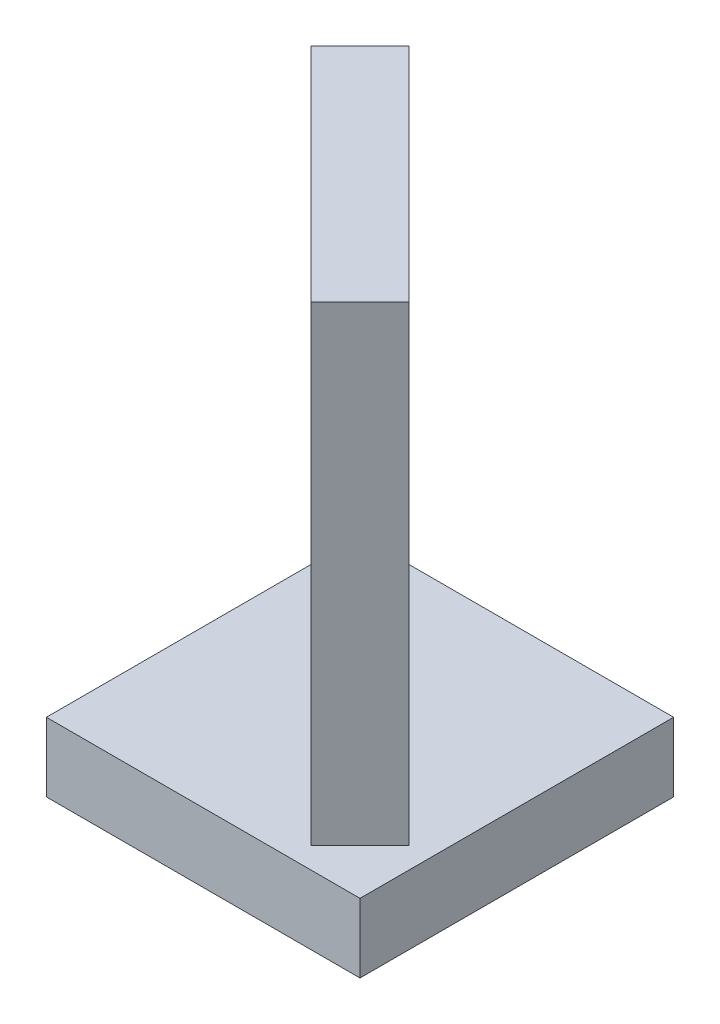
ISO-10303-21;
HEADER;
FILE_DESCRIPTION(('STEP AP214'),'2;1');
FILE_NAME('part.step','',(''),(''),'','','');
FILE_SCHEMA(('AUTOMOTIVE_DESIGN { 1 0 10303 214 1 1 1 1 }'));
ENDSEC;
DATA;
#1=APPLICATION_CONTEXT('core data for automotive mechanical design processes');
#2=APPLICATION_PROTOCOL_DEFINITION('international standard','automotive_design',2000,#1);
#3=PRODUCT_CONTEXT('',#1,'mechanical');
#4=PRODUCT('Part','Part','',(#3));
#5=PRODUCT_RELATED_PRODUCT_CATEGORY('part','',(#4));
#6=PRODUCT_DEFINITION_FORMATION('','',#4);
#7=PRODUCT_DEFINITION_CONTEXT('part definition',#1,'design');
#8=PRODUCT_DEFINITION('design','',#6,#7);
#9=PRODUCT_DEFINITION_SHAPE('','',#8);
#10=(LENGTH_UNIT() NAMED_UNIT(*) SI_UNIT(.MILLI.,.METRE.));
#11=(NAMED_UNIT(*) PLANE_ANGLE_UNIT() SI_UNIT($,.RADIAN.));
#12=(NAMED_UNIT(*) SI_UNIT($,.STERADIAN.) SOLID_ANGLE_UNIT());
#13=UNCERTAINTY_MEASURE_WITH_UNIT(LENGTH_MEASURE(1.E-05),#10,'distance_accuracy_value','');
#14=(GEOMETRIC_REPRESENTATION_CONTEXT(3) GLOBAL_UNCERTAINTY_ASSIGNED_CONTEXT((#13)) GLOBAL_UNIT_ASSIGNED_CONTEXT((#10,
#11,#12)) REPRESENTATION_CONTEXT('',''));
#15=CARTESIAN_POINT('',(0.,0.,0.));
#16=DIRECTION('',(0.,0.,1.));
#17=DIRECTION('',(1.,0.,0.));
#18=AXIS2_PLACEMENT_3D('',#15,#16,#17);
#19=CARTESIAN_POINT('',(0.,5.588,0.));
#20=DIRECTION('',(0.,-1.,0.));
#21=DIRECTION('',(0.,0.,-1.));
#22=AXIS2_PLACEMENT_3D('',#19,#20,#21);
#23=PLANE('',#22);
#24=DIRECTION('',(0.,0.,-1.));
#25=VECTOR('',#24,1.);
#26=CARTESIAN_POINT('',(12.7,5.588,12.7));
#27=LINE('',#26,#25);
#28=CARTESIAN_POINT('',(12.7,5.588,12.7));
#29=VERTEX_POINT('',#28);
#30=CARTESIAN_POINT('',(12.7,5.588,-12.7));
#31=VERTEX_POINT('',#30);
#32=EDGE_CURVE('E128',#29,#31,#27,.T.);
#33=ORIENTED_EDGE('',*,*,#32,.T.);
#34=DIRECTION('',(-1.,0.,0.));
#35=VECTOR('',#34,1.);
#36=CARTESIAN_POINT('',(-12.7,5.588,-12.7));
#37=LINE('',#36,#35);
#38=CARTESIAN_POINT('',(-12.7,5.588,-12.7));
#39=VERTEX_POINT('',#38);
#40=EDGE_CURVE('E131',#31,#39,#37,.T.);
#41=ORIENTED_EDGE('',*,*,#40,.T.);
#42=DIRECTION('',(0.,0.,1.));
#43=VECTOR('',#42,1.);
#44=CARTESIAN_POINT('',(-12.7,5.588,12.7));
#45=LINE('',#44,#43);
#46=CARTESIAN_POINT('',(-12.7,5.588,12.7));
#47=VERTEX_POINT('',#46);
#48=EDGE_CURVE('E134',#39,#47,#45,.T.);
#49=ORIENTED_EDGE('',*,*,#48,.T.);
#50=DIRECTION('',(1.,0.,0.));
#51=VECTOR('',#50,1.);
#52=CARTESIAN_POINT('',(-12.7,5.588,12.7));
#53=LINE('',#52,#51);
#54=EDGE_CURVE('E136',#47,#29,#53,.T.);
#55=ORIENTED_EDGE('',*,*,#54,.T.);
#56=EDGE_LOOP('',(#33,#41,#49,#55));
#57=FACE_BOUND('',#56,.T.);
#58=DIRECTION('',(0.707106781186545,0.,-0.70710678118655));
#59=VECTOR('',#58,1.);
#60=CARTESIAN_POINT('',(10.9559124677044,5.588,7.00459977443394));
#61=LINE('',#60,#59);
#62=CARTESIAN_POINT('',(7.00459977443395,5.588,10.9559124677044));
#63=VERTEX_POINT('',#62);
#64=CARTESIAN_POINT('',(10.9559124677044,5.588,7.00459977443394));
#65=VERTEX_POINT('',#64);
#66=EDGE_CURVE('E118',#63,#65,#61,.T.);
#67=ORIENTED_EDGE('',*,*,#66,.F.);
#68=DIRECTION('',(0.707106781186547,0.,0.707106781186548));
#69=VECTOR('',#68,1.);
#70=CARTESIAN_POINT('',(-10.9559124677044,5.588,-7.00459977443395));
#71=LINE('',#70,#69);
#72=CARTESIAN_POINT('',(-10.9559124677044,5.588,-7.00459977443395));
#73=VERTEX_POINT('',#72);
#74=EDGE_CURVE('E115',#73,#63,#71,.T.);
#75=ORIENTED_EDGE('',*,*,#74,.F.);
#76=DIRECTION('',(-0.70710678118655,0.,0.707106781186545));
#77=VECTOR('',#76,1.);
#78=CARTESIAN_POINT('',(-7.00459977443394,5.588,-10.9559124677044));
#79=LINE('',#78,#77);
#80=CARTESIAN_POINT('',(-7.00459977443394,5.588,-10.9559124677044));
#81=VERTEX_POINT('',#80);
#82=EDGE_CURVE('E53',#81,#73,#79,.T.);
#83=ORIENTED_EDGE('',*,*,#82,.F.);
#84=DIRECTION('',(-0.707106781186548,0.,-0.707106781186548));
#85=VECTOR('',#84,1.);
#86=CARTESIAN_POINT('',(-7.00459977443394,5.588,-10.9559124677044));
#87=LINE('',#86,#85);
#88=EDGE_CURVE('E48',#65,#81,#87,.T.);
#89=ORIENTED_EDGE('',*,*,#88,.F.);
#90=EDGE_LOOP('',(#67,#75,#83,#89));
#91=FACE_BOUND('',#90,.T.);
#92=ADVANCED_FACE('F33',(#57,#91),#23,.F.);
#93=CARTESIAN_POINT('',(12.7,5.588,12.7));
#94=DIRECTION('',(-1.,0.,0.));
#95=DIRECTION('',(0.,0.,1.));
#96=AXIS2_PLACEMENT_3D('',#93,#94,#95);
#97=PLANE('',#96);
#98=DIRECTION('',(0.,0.,-1.));
#99=VECTOR('',#98,1.);
#100=CARTESIAN_POINT('',(12.7,0.,12.7));
#101=LINE('',#100,#99);
#102=CARTESIAN_POINT('',(12.7,0.,12.7));
#103=VERTEX_POINT('',#102);
#104=CARTESIAN_POINT('',(12.7,0.,-12.7));
#105=VERTEX_POINT('',#104);
#106=EDGE_CURVE('E119',#103,#105,#101,.T.);
#107=ORIENTED_EDGE('',*,*,#106,.T.);
#108=DIRECTION('',(0.,-1.,0.));
#109=VECTOR('',#108,1.);
#110=CARTESIAN_POINT('',(12.7,5.588,-12.7));
#111=LINE('',#110,#109);
#112=EDGE_CURVE('E11',#31,#105,#111,.T.);
#113=ORIENTED_EDGE('',*,*,#112,.F.);
#114=ORIENTED_EDGE('',*,*,#32,.F.);
#115=DIRECTION('',(0.,-1.,0.));
#116=VECTOR('',#115,1.);
#117=CARTESIAN_POINT('',(12.7,5.588,12.7));
#118=LINE('',#117,#116);
#119=EDGE_CURVE('E137',#29,#103,#118,.T.);
#120=ORIENTED_EDGE('',*,*,#119,.T.);
#121=EDGE_LOOP('',(#107,#113,#114,#120));
#122=FACE_BOUND('',#121,.T.);
#123=ADVANCED_FACE('F35',(#122),#97,.F.);
#124=CARTESIAN_POINT('',(-12.7,5.588,-12.7));
#125=DIRECTION('',(0.,0.,1.));
#126=DIRECTION('',(1.,0.,0.));
#127=AXIS2_PLACEMENT_3D('',#124,#125,#126);
#128=PLANE('',#127);
#129=DIRECTION('',(-1.,0.,0.));
#130=VECTOR('',#129,1.);
#131=CARTESIAN_POINT('',(-12.7,0.,-12.7));
#132=LINE('',#131,#130);
#133=CARTESIAN_POINT('',(-12.7,0.,-12.7));
#134=VERTEX_POINT('',#133);
#135=EDGE_CURVE('E122',#105,#134,#132,.T.);
#136=ORIENTED_EDGE('',*,*,#135,.T.);
#137=DIRECTION('',(0.,-1.,0.));
#138=VECTOR('',#137,1.);
#139=CARTESIAN_POINT('',(-12.7,5.588,-12.7));
#140=LINE('',#139,#138);
#141=EDGE_CURVE('E41',#39,#134,#140,.T.);
#142=ORIENTED_EDGE('',*,*,#141,.F.);
#143=ORIENTED_EDGE('',*,*,#40,.F.);
#144=ORIENTED_EDGE('',*,*,#112,.T.);
#145=EDGE_LOOP('',(#136,#142,#143,#144));
#146=FACE_BOUND('',#145,.T.);
#147=ADVANCED_FACE('F167',(#146),#128,.F.);
#148=CARTESIAN_POINT('',(-12.7,5.588,12.7));
#149=DIRECTION('',(1.,0.,0.));
#150=DIRECTION('',(0.,0.,-1.));
#151=AXIS2_PLACEMENT_3D('',#148,#149,#150);
#152=PLANE('',#151);
#153=DIRECTION('',(0.,0.,1.));
#154=VECTOR('',#153,1.);
#155=CARTESIAN_POINT('',(-12.7,0.,12.7));
#156=LINE('',#155,#154);
#157=CARTESIAN_POINT('',(-12.7,0.,12.7));
#158=VERTEX_POINT('',#157);
#159=EDGE_CURVE('E140',#134,#158,#156,.T.);
#160=ORIENTED_EDGE('',*,*,#159,.T.);
#161=DIRECTION('',(0.,-1.,0.));
#162=VECTOR('',#161,1.);
#163=CARTESIAN_POINT('',(-12.7,5.588,12.7));
#164=LINE('',#163,#162);
#165=EDGE_CURVE('E145',#47,#158,#164,.T.);
#166=ORIENTED_EDGE('',*,*,#165,.F.);
#167=ORIENTED_EDGE('',*,*,#48,.F.);
#168=ORIENTED_EDGE('',*,*,#141,.T.);
#169=EDGE_LOOP('',(#160,#166,#167,#168));
#170=FACE_BOUND('',#169,.T.);
#171=ADVANCED_FACE('F152',(#170),#152,.F.);
#172=CARTESIAN_POINT('',(-12.7,5.588,12.7));
#173=DIRECTION('',(0.,0.,-1.));
#174=DIRECTION('',(-1.,0.,0.));
#175=AXIS2_PLACEMENT_3D('',#172,#173,#174);
#176=PLANE('',#175);
#177=DIRECTION('',(1.,0.,0.));
#178=VECTOR('',#177,1.);
#179=CARTESIAN_POINT('',(-12.7,0.,12.7));
#180=LINE('',#179,#178);
#181=EDGE_CURVE('E132',#158,#103,#180,.T.);
#182=ORIENTED_EDGE('',*,*,#181,.T.);
#183=ORIENTED_EDGE('',*,*,#119,.F.);
#184=ORIENTED_EDGE('',*,*,#54,.F.);
#185=ORIENTED_EDGE('',*,*,#165,.T.);
#186=EDGE_LOOP('',(#182,#183,#184,#185));
#187=FACE_BOUND('',#186,.T.);
#188=ADVANCED_FACE('F161',(#187),#176,.F.);
#189=CARTESIAN_POINT('',(0.,0.,0.));
#190=DIRECTION('',(0.,-1.,0.));
#191=DIRECTION('',(0.,0.,-1.));
#192=AXIS2_PLACEMENT_3D('',#189,#190,#191);
#193=PLANE('',#192);
#194=ORIENTED_EDGE('',*,*,#106,.F.);
#195=ORIENTED_EDGE('',*,*,#181,.F.);
#196=ORIENTED_EDGE('',*,*,#159,.F.);
#197=ORIENTED_EDGE('',*,*,#135,.F.);
#198=EDGE_LOOP('',(#194,#195,#196,#197));
#199=FACE_BOUND('',#198,.T.);
#200=ADVANCED_FACE('F158',(#199),#193,.T.);
#201=CARTESIAN_POINT('',(10.9559124677044,43.688,7.00459977443394));
#202=DIRECTION('',(-0.70710678118655,0.,-0.707106781186545));
#203=DIRECTION('',(-0.707106781186545,0.,0.70710678118655));
#204=AXIS2_PLACEMENT_3D('',#201,#202,#203);
#205=PLANE('',#204);
#206=ORIENTED_EDGE('',*,*,#66,.T.);
#207=DIRECTION('',(0.,-1.,0.));
#208=VECTOR('',#207,1.);
#209=CARTESIAN_POINT('',(10.9559124677044,43.688,7.00459977443394));
#210=LINE('',#209,#208);
#211=CARTESIAN_POINT('',(10.9559124677044,43.688,7.00459977443394));
#212=VERTEX_POINT('',#211);
#213=EDGE_CURVE('E99',#212,#65,#210,.T.);
#214=ORIENTED_EDGE('',*,*,#213,.F.);
#215=DIRECTION('',(0.707106781186545,0.,-0.70710678118655));
#216=VECTOR('',#215,1.);
#217=CARTESIAN_POINT('',(10.9559124677044,43.688,7.00459977443394));
#218=LINE('',#217,#216);
#219=CARTESIAN_POINT('',(7.00459977443395,43.688,10.9559124677044));
#220=VERTEX_POINT('',#219);
#221=EDGE_CURVE('E106',#220,#212,#218,.T.);
#222=ORIENTED_EDGE('',*,*,#221,.F.);
#223=DIRECTION('',(0.,-1.,0.));
#224=VECTOR('',#223,1.);
#225=CARTESIAN_POINT('',(7.00459977443395,43.688,10.9559124677044));
#226=LINE('',#225,#224);
#227=EDGE_CURVE('E260',#220,#63,#226,.T.);
#228=ORIENTED_EDGE('',*,*,#227,.T.);
#229=EDGE_LOOP('',(#206,#214,#222,#228));
#230=FACE_BOUND('',#229,.T.);
#231=ADVANCED_FACE('F117',(#230),#205,.F.);
#232=CARTESIAN_POINT('',(-7.00459977443394,43.688,-10.9559124677044));
#233=DIRECTION('',(-0.707106781186548,0.,0.707106781186548));
#234=DIRECTION('',(0.707106781186548,0.,0.707106781186548));
#235=AXIS2_PLACEMENT_3D('',#232,#233,#234);
#236=PLANE('',#235);
#237=ORIENTED_EDGE('',*,*,#88,.T.);
#238=DIRECTION('',(0.,-1.,0.));
#239=VECTOR('',#238,1.);
#240=CARTESIAN_POINT('',(-7.00459977443394,43.688,-10.9559124677044));
#241=LINE('',#240,#239);
#242=CARTESIAN_POINT('',(-7.00459977443394,43.688,-10.9559124677044));
#243=VERTEX_POINT('',#242);
#244=EDGE_CURVE('E102',#243,#81,#241,.T.);
#245=ORIENTED_EDGE('',*,*,#244,.F.);
#246=DIRECTION('',(-0.707106781186548,0.,-0.707106781186548));
#247=VECTOR('',#246,1.);
#248=CARTESIAN_POINT('',(-7.00459977443394,43.688,-10.9559124677044));
#249=LINE('',#248,#247);
#250=EDGE_CURVE('E95',#212,#243,#249,.T.);
#251=ORIENTED_EDGE('',*,*,#250,.F.);
#252=ORIENTED_EDGE('',*,*,#213,.T.);
#253=EDGE_LOOP('',(#237,#245,#251,#252));
#254=FACE_BOUND('',#253,.T.);
#255=ADVANCED_FACE('F97',(#254),#236,.F.);
#256=CARTESIAN_POINT('',(-7.00459977443394,43.688,-10.9559124677044));
#257=DIRECTION('',(0.707106781186545,0.,0.70710678118655));
#258=DIRECTION('',(0.70710678118655,0.,-0.707106781186545));
#259=AXIS2_PLACEMENT_3D('',#256,#257,#258);
#260=PLANE('',#259);
#261=ORIENTED_EDGE('',*,*,#82,.T.);
#262=DIRECTION('',(0.,-1.,0.));
#263=VECTOR('',#262,1.);
#264=CARTESIAN_POINT('',(-10.9559124677044,43.688,-7.00459977443395));
#265=LINE('',#264,#263);
#266=CARTESIAN_POINT('',(-10.9559124677044,43.688,-7.00459977443395));
#267=VERTEX_POINT('',#266);
#268=EDGE_CURVE('E124',#267,#73,#265,.T.);
#269=ORIENTED_EDGE('',*,*,#268,.F.);
#270=DIRECTION('',(-0.70710678118655,0.,0.707106781186545));
#271=VECTOR('',#270,1.);
#272=CARTESIAN_POINT('',(-7.00459977443394,43.688,-10.9559124677044));
#273=LINE('',#272,#271);
#274=EDGE_CURVE('E105',#243,#267,#273,.T.);
#275=ORIENTED_EDGE('',*,*,#274,.F.);
#276=ORIENTED_EDGE('',*,*,#244,.T.);
#277=EDGE_LOOP('',(#261,#269,#275,#276));
#278=FACE_BOUND('',#277,.T.);
#279=ADVANCED_FACE('F203',(#278),#260,.F.);
#280=CARTESIAN_POINT('',(-10.9559124677044,43.688,-7.00459977443395));
#281=DIRECTION('',(0.707106781186548,0.,-0.707106781186547));
#282=DIRECTION('',(-0.707106781186547,0.,-0.707106781186548));
#283=AXIS2_PLACEMENT_3D('',#280,#281,#282);
#284=PLANE('',#283);
#285=ORIENTED_EDGE('',*,*,#74,.T.);
#286=ORIENTED_EDGE('',*,*,#227,.F.);
#287=DIRECTION('',(0.707106781186547,0.,0.707106781186548));
#288=VECTOR('',#287,1.);
#289=CARTESIAN_POINT('',(-10.9559124677044,43.688,-7.00459977443395));
#290=LINE('',#289,#288);
#291=EDGE_CURVE('E111',#267,#220,#290,.T.);
#292=ORIENTED_EDGE('',*,*,#291,.F.);
#293=ORIENTED_EDGE('',*,*,#268,.T.);
#294=EDGE_LOOP('',(#285,#286,#292,#293));
#295=FACE_BOUND('',#294,.T.);
#296=ADVANCED_FACE('F209',(#295),#284,.F.);
#297=CARTESIAN_POINT('',(0.,43.688,0.));
#298=DIRECTION('',(0.,1.,0.));
#299=DIRECTION('',(0.,0.,1.));
#300=AXIS2_PLACEMENT_3D('',#297,#298,#299);
#301=PLANE('',#300);
#302=ORIENTED_EDGE('',*,*,#221,.T.);
#303=ORIENTED_EDGE('',*,*,#250,.T.);
#304=ORIENTED_EDGE('',*,*,#274,.T.);
#305=ORIENTED_EDGE('',*,*,#291,.T.);
#306=EDGE_LOOP('',(#302,#303,#304,#305));
#307=FACE_BOUND('',#306,.T.);
#308=ADVANCED_FACE('F109',(#307),#301,.T.);
#309=CLOSED_SHELL('',(#92,#123,#147,#171,#188,#200,#231,#255,#279,#296,#308));
#310=MANIFOLD_SOLID_BREP('B2',#309);
#311=ADVANCED_BREP_SHAPE_REPRESENTATION('',(#18,#310),#14);
#312=SHAPE_DEFINITION_REPRESENTATION(#9,#311);
ENDSEC;
END-ISO-10303-21;
